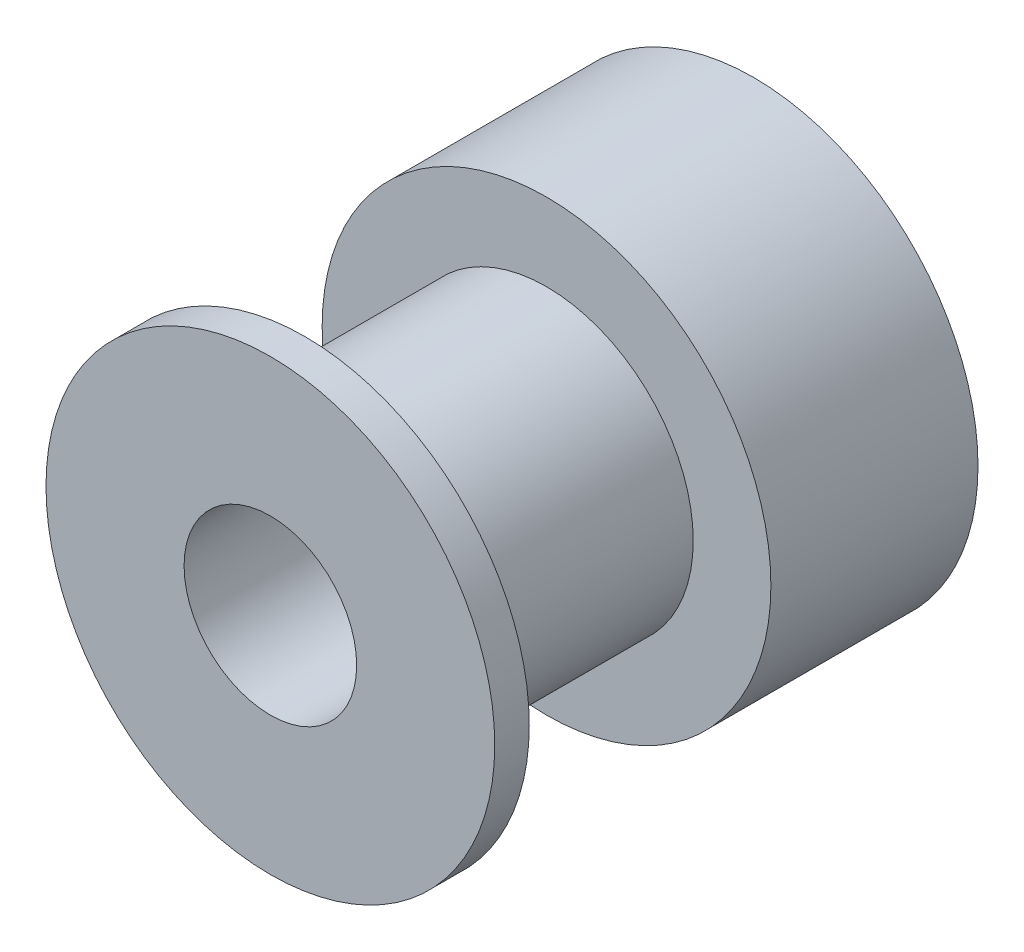
ISO-10303-21;
HEADER;
FILE_DESCRIPTION(('STEP AP214'),'2;1');
FILE_NAME('part.step','',(''),(''),'','','');
FILE_SCHEMA(('AUTOMOTIVE_DESIGN { 1 0 10303 214 1 1 1 1 }'));
ENDSEC;
DATA;
#1=APPLICATION_CONTEXT('core data for automotive mechanical design processes');
#2=APPLICATION_PROTOCOL_DEFINITION('international standard','automotive_design',2000,#1);
#3=PRODUCT_CONTEXT('',#1,'mechanical');
#4=PRODUCT('Part','Part','',(#3));
#5=PRODUCT_RELATED_PRODUCT_CATEGORY('part','',(#4));
#6=PRODUCT_DEFINITION_FORMATION('','',#4);
#7=PRODUCT_DEFINITION_CONTEXT('part definition',#1,'design');
#8=PRODUCT_DEFINITION('design','',#6,#7);
#9=PRODUCT_DEFINITION_SHAPE('','',#8);
#10=(LENGTH_UNIT() NAMED_UNIT(*) SI_UNIT(.MILLI.,.METRE.));
#11=(NAMED_UNIT(*) PLANE_ANGLE_UNIT() SI_UNIT($,.RADIAN.));
#12=(NAMED_UNIT(*) SI_UNIT($,.STERADIAN.) SOLID_ANGLE_UNIT());
#13=UNCERTAINTY_MEASURE_WITH_UNIT(LENGTH_MEASURE(1.E-05),#10,'distance_accuracy_value','');
#14=(GEOMETRIC_REPRESENTATION_CONTEXT(3) GLOBAL_UNCERTAINTY_ASSIGNED_CONTEXT((#13)) GLOBAL_UNIT_ASSIGNED_CONTEXT((#10,
#11,#12)) REPRESENTATION_CONTEXT('',''));
#15=CARTESIAN_POINT('',(0.,0.,0.));
#16=DIRECTION('',(0.,0.,1.));
#17=DIRECTION('',(1.,0.,0.));
#18=AXIS2_PLACEMENT_3D('',#15,#16,#17);
#19=CARTESIAN_POINT('',(0.,0.,6.));
#20=DIRECTION('',(0.,0.,-1.));
#21=DIRECTION('',(-1.,0.,0.));
#22=AXIS2_PLACEMENT_3D('',#19,#20,#21);
#23=CYLINDRICAL_SURFACE('',#22,6.5);
#24=CARTESIAN_POINT('',(-6.5,0.,4.5));
#25=CARTESIAN_POINT('',(-6.49999849532867,-0.0830761724763344,4.49999733464411));
#26=CARTESIAN_POINT('',(-6.49839124214547,-0.166183602986827,4.49307507318891));
#27=CARTESIAN_POINT('',(-6.49213500375529,-0.330029933246627,4.46560235711435));
#28=CARTESIAN_POINT('',(-6.48748401185166,-0.410767233683362,4.4450429115586));
#29=CARTESIAN_POINT('',(-6.47565710646771,-0.567482400649439,4.39098030105907));
#30=CARTESIAN_POINT('',(-6.46848397910972,-0.643465410431957,4.35749141486865));
#31=CARTESIAN_POINT('',(-6.45238316831829,-0.788732955280501,4.27856773493164));
#32=CARTESIAN_POINT('',(-6.44345549077589,-0.85801751283594,4.23313298129406));
#33=CARTESIAN_POINT('',(-6.42464323305021,-0.98915235312321,4.13075474832276));
#34=CARTESIAN_POINT('',(-6.41474568654138,-1.05086679216121,4.07363963829749));
#35=CARTESIAN_POINT('',(-6.39519859507266,-1.16393060397695,3.94989007342867));
#36=CARTESIAN_POINT('',(-6.38554907436474,-1.2152789664991,3.88325469183953));
#37=CARTESIAN_POINT('',(-6.36746174180576,-1.3067669575256,3.74133307243966));
#38=CARTESIAN_POINT('',(-6.35904049089481,-1.34675925477788,3.66594955902317));
#39=CARTESIAN_POINT('',(-6.34455046029963,-1.41345395330062,3.50930490134943));
#40=CARTESIAN_POINT('',(-6.33848136485541,-1.44015813854149,3.4280445477549));
#41=CARTESIAN_POINT('',(-6.32951534623235,-1.4790642425856,3.26343419841731));
#42=CARTESIAN_POINT('',(-6.32656557105072,-1.49150809496879,3.1801443266252));
#43=CARTESIAN_POINT('',(-6.32401364937952,-1.50229307046533,3.01261091295436));
#44=CARTESIAN_POINT('',(-6.32441104286173,-1.50063613156308,2.92836750371725));
#45=CARTESIAN_POINT('',(-6.32846083321139,-1.48346063285703,2.7631371921762));
#46=CARTESIAN_POINT('',(-6.33204661249555,-1.46822575315178,2.68211891865606));
#47=CARTESIAN_POINT('',(-6.34196351386388,-1.42477741479348,2.52382020809838));
#48=CARTESIAN_POINT('',(-6.34829480548987,-1.39656315462671,2.44654000222292));
#49=CARTESIAN_POINT('',(-6.36305332227188,-1.32770349075046,2.29712732835907));
#50=CARTESIAN_POINT('',(-6.37149843240945,-1.28695129246528,2.22504591908903));
#51=CARTESIAN_POINT('',(-6.38952239681953,-1.19424748975256,2.08864076371062));
#52=CARTESIAN_POINT('',(-6.39910142196225,-1.14229419645531,2.02431818974098));
#53=CARTESIAN_POINT('',(-6.41859777640793,-1.02717321086453,1.90362604994903));
#54=CARTESIAN_POINT('',(-6.42851768847713,-0.963764950845054,1.84748611487504));
#55=CARTESIAN_POINT('',(-6.44736816069401,-0.828318641053406,1.74659692902464));
#56=CARTESIAN_POINT('',(-6.45629869876005,-0.75628039874503,1.70184793245142));
#57=CARTESIAN_POINT('',(-6.47219854082994,-0.605321277972371,1.62494408585668));
#58=CARTESIAN_POINT('',(-6.47916273202417,-0.526383143294249,1.59282198430733));
#59=CARTESIAN_POINT('',(-6.49030757986402,-0.364032396252583,1.54236385630495));
#60=CARTESIAN_POINT('',(-6.49448868821629,-0.280620512374238,1.52402559261153));
#61=CARTESIAN_POINT('',(-6.49953102945198,-0.11365732393164,1.50199584965185));
#62=CARTESIAN_POINT('',(-6.50046326526885,-0.030149445012729,1.49799106394027));
#63=CARTESIAN_POINT('',(-6.49910299913129,0.136342371579224,1.50388901475928));
#64=CARTESIAN_POINT('',(-6.49681074208307,0.219326348562745,1.513790695068));
#65=CARTESIAN_POINT('',(-6.48930412349636,0.381357903798023,1.54696119660577));
#66=CARTESIAN_POINT('',(-6.48412623941868,0.4604414648757,1.57006324131714));
#67=CARTESIAN_POINT('',(-6.47142910428788,0.613609622481664,1.62879158892437));
#68=CARTESIAN_POINT('',(-6.4639096389422,0.687693760726587,1.66441903813585));
#69=CARTESIAN_POINT('',(-6.44718996088191,0.830037615110187,1.74782264392098));
#70=CARTESIAN_POINT('',(-6.43796535296184,0.898188410296326,1.7957796918852));
#71=CARTESIAN_POINT('',(-6.41890391913982,1.02558718048179,1.90224561735856));
#72=CARTESIAN_POINT('',(-6.40906700421673,1.08483385664762,1.96075603154156));
#73=CARTESIAN_POINT('',(-6.38964047483402,1.19400102833017,2.08811238587903));
#74=CARTESIAN_POINT('',(-6.3800601750374,1.24370343589042,2.1571469646774));
#75=CARTESIAN_POINT('',(-6.36246188496285,1.33081235446409,2.30276588021528));
#76=CARTESIAN_POINT('',(-6.35444382521927,1.3682194122462,2.37934988103845));
#77=CARTESIAN_POINT('',(-6.34095951164845,1.42941066868129,2.53747598842252));
#78=CARTESIAN_POINT('',(-6.33547846174878,1.45327404481082,2.61898612968344));
#79=CARTESIAN_POINT('',(-6.3276660054956,1.48692530676327,2.78500399284777));
#80=CARTESIAN_POINT('',(-6.32533402889436,1.49671574099563,2.86951116919002));
#81=CARTESIAN_POINT('',(-6.32412253425542,1.50182536015786,3.03691822705262));
#82=CARTESIAN_POINT('',(-6.32516029248236,1.49749127871471,3.11980711064856));
#83=CARTESIAN_POINT('',(-6.33038270361014,1.47525685980881,3.28363867866818));
#84=CARTESIAN_POINT('',(-6.33456731037362,1.45735672124418,3.36458139160761));
#85=CARTESIAN_POINT('',(-6.34556939165105,1.40867420720143,3.52190991079113));
#86=CARTESIAN_POINT('',(-6.35237543592818,1.37794771033572,3.59831386070585));
#87=CARTESIAN_POINT('',(-6.36785683112449,1.304530822271,3.74493180654133));
#88=CARTESIAN_POINT('',(-6.37653240158127,1.26183902581514,3.81514507412735));
#89=CARTESIAN_POINT('',(-6.39501829374307,1.16457679516263,3.94908552859008));
#90=CARTESIAN_POINT('',(-6.4048496868242,1.10976162033287,4.01263211954958));
#91=CARTESIAN_POINT('',(-6.42440402438128,0.990297714593212,4.12973824763829));
#92=CARTESIAN_POINT('',(-6.43412694306169,0.92564669602438,4.18329545493028));
#93=CARTESIAN_POINT('',(-6.45253999299533,0.787191932761554,4.27966726794881));
#94=CARTESIAN_POINT('',(-6.46121270567525,0.713266869084886,4.32231111828978));
#95=CARTESIAN_POINT('',(-6.47637045552876,0.559109641475368,4.39449914940861));
#96=CARTESIAN_POINT('',(-6.48285722936411,0.478882547101934,4.42405373510293));
#97=CARTESIAN_POINT('',(-6.49182723396727,0.332210374198767,4.46427847355574));
#98=CARTESIAN_POINT('',(-6.49487228966801,0.266526367321008,4.477647271027));
#99=CARTESIAN_POINT('',(-6.4989592245111,0.133901630280835,4.49550886661472));
#100=CARTESIAN_POINT('',(-6.5000012127936,0.0669609687898304,4.50000214832734));
#101=CARTESIAN_POINT('',(-6.5,0.,4.5));
#102=B_SPLINE_CURVE_WITH_KNOTS('',3,(#24,#25,#26,#27,#28,#29,#30,#31,#32,#33,#34,#35,#36,#37,
#38,#39,#40,#41,#42,#43,#44,#45,#46,#47,#48,#49,#50,#51,#52,#53,#54,#55,#56,#57,#58,#59,#60,#61,
#62,#63,#64,#65,#66,#67,#68,#69,#70,#71,#72,#73,#74,#75,#76,#77,#78,#79,#80,#81,#82,#83,#84,#85,
#86,#87,#88,#89,#90,#91,#92,#93,#94,#95,#96,#97,#98,#99,#100,#101),.UNSPECIFIED.,.T.,.F.,(4,2,2,
2,2,2,2,2,2,2,2,2,2,2,2,2,2,2,2,2,2,2,2,2,2,2,2,2,2,2,2,2,2,2,2,2,2,2,4),(0.,0.248983311217114,
0.498130939431098,0.747004202472747,0.995876629917202,1.24870930222222,1.50156660317464,
1.75756840109411,2.0135358206962,2.26509316141456,2.51661592915602,2.76300377758328,
3.00940684320484,3.25796969712265,3.50657005489342,3.7611752627951,4.01578615203542,
4.27105309773002,4.52627860236006,4.77589001432916,5.02548246887371,5.27198911757478,
5.51851833225481,5.76889433751052,6.01930682944867,6.27489540554877,6.53047261420162,
6.7845398863154,7.03856114466417,7.28639401438666,7.53422325058917,7.78098389306531,
8.02777352833801,8.28009323709707,8.53247172133002,8.78858609727297,9.04449651578221,
9.24519271684376,9.44587798236134),.UNSPECIFIED.);
#103=CARTESIAN_POINT('',(-6.5,0.,4.5));
#104=VERTEX_POINT('',#103);
#105=EDGE_CURVE('E72',#104,#104,#102,.T.);
#106=ORIENTED_EDGE('',*,*,#105,.T.);
#107=EDGE_LOOP('',(#106));
#108=FACE_BOUND('',#107,.T.);
#109=CARTESIAN_POINT('',(0.,-6.5,4.5));
#110=CARTESIAN_POINT('',(0.0830761724763347,-6.49999849532867,4.49999733464411));
#111=CARTESIAN_POINT('',(0.166183602986827,-6.49839124214547,4.49307507318891));
#112=CARTESIAN_POINT('',(0.330029933246627,-6.49213500375529,4.46560235711435));
#113=CARTESIAN_POINT('',(0.410767233683363,-6.48748401185166,4.4450429115586));
#114=CARTESIAN_POINT('',(0.567482400649439,-6.47565710646771,4.39098030105907));
#115=CARTESIAN_POINT('',(0.643465410431957,-6.46848397910972,4.35749141486865));
#116=CARTESIAN_POINT('',(0.788732955280501,-6.45238316831829,4.27856773493164));
#117=CARTESIAN_POINT('',(0.85801751283594,-6.44345549077589,4.23313298129406));
#118=CARTESIAN_POINT('',(0.989152353123209,-6.42464323305021,4.13075474832276));
#119=CARTESIAN_POINT('',(1.05086679216121,-6.41474568654138,4.07363963829749));
#120=CARTESIAN_POINT('',(1.16393060397695,-6.39519859507266,3.94989007342867));
#121=CARTESIAN_POINT('',(1.2152789664991,-6.38554907436474,3.88325469183953));
#122=CARTESIAN_POINT('',(1.3067669575256,-6.36746174180576,3.74133307243966));
#123=CARTESIAN_POINT('',(1.34675925477788,-6.35904049089481,3.66594955902317));
#124=CARTESIAN_POINT('',(1.41345395330062,-6.34455046029963,3.50930490134943));
#125=CARTESIAN_POINT('',(1.44015813854149,-6.33848136485541,3.4280445477549));
#126=CARTESIAN_POINT('',(1.4790642425856,-6.32951534623235,3.26343419841731));
#127=CARTESIAN_POINT('',(1.49150809496879,-6.32656557105072,3.1801443266252));
#128=CARTESIAN_POINT('',(1.50229307046533,-6.32401364937952,3.01261091295436));
#129=CARTESIAN_POINT('',(1.50063613156308,-6.32441104286173,2.92836750371725));
#130=CARTESIAN_POINT('',(1.48346063285703,-6.32846083321139,2.7631371921762));
#131=CARTESIAN_POINT('',(1.46822575315178,-6.33204661249556,2.68211891865606));
#132=CARTESIAN_POINT('',(1.42477741479348,-6.34196351386388,2.52382020809838));
#133=CARTESIAN_POINT('',(1.39656315462671,-6.34829480548987,2.44654000222292));
#134=CARTESIAN_POINT('',(1.32770349075046,-6.36305332227188,2.29712732835907));
#135=CARTESIAN_POINT('',(1.28695129246528,-6.37149843240945,2.22504591908903));
#136=CARTESIAN_POINT('',(1.19424748975256,-6.38952239681953,2.08864076371062));
#137=CARTESIAN_POINT('',(1.1422941964553,-6.39910142196225,2.02431818974098));
#138=CARTESIAN_POINT('',(1.02717321086453,-6.41859777640793,1.90362604994903));
#139=CARTESIAN_POINT('',(0.963764950845054,-6.42851768847713,1.84748611487504));
#140=CARTESIAN_POINT('',(0.828318641053406,-6.44736816069401,1.74659692902464));
#141=CARTESIAN_POINT('',(0.75628039874503,-6.45629869876005,1.70184793245142));
#142=CARTESIAN_POINT('',(0.605321277972371,-6.47219854082994,1.62494408585668));
#143=CARTESIAN_POINT('',(0.526383143294248,-6.47916273202417,1.59282198430733));
#144=CARTESIAN_POINT('',(0.364032396252582,-6.49030757986402,1.54236385630495));
#145=CARTESIAN_POINT('',(0.280620512374237,-6.49448868821629,1.52402559261153));
#146=CARTESIAN_POINT('',(0.11365732393164,-6.49953102945198,1.50199584965185));
#147=CARTESIAN_POINT('',(0.0301494450127289,-6.50046326526885,1.49799106394027));
#148=CARTESIAN_POINT('',(-0.136342371579224,-6.49910299913129,1.50388901475928));
#149=CARTESIAN_POINT('',(-0.219326348562745,-6.49681074208307,1.513790695068));
#150=CARTESIAN_POINT('',(-0.381357903798023,-6.48930412349636,1.54696119660577));
#151=CARTESIAN_POINT('',(-0.4604414648757,-6.48412623941868,1.57006324131714));
#152=CARTESIAN_POINT('',(-0.613609622481664,-6.47142910428788,1.62879158892437));
#153=CARTESIAN_POINT('',(-0.687693760726587,-6.4639096389422,1.66441903813585));
#154=CARTESIAN_POINT('',(-0.830037615110187,-6.44718996088191,1.74782264392098));
#155=CARTESIAN_POINT('',(-0.898188410296326,-6.43796535296184,1.7957796918852));
#156=CARTESIAN_POINT('',(-1.02558718048179,-6.41890391913982,1.90224561735856));
#157=CARTESIAN_POINT('',(-1.08483385664762,-6.40906700421673,1.96075603154156));
#158=CARTESIAN_POINT('',(-1.19400102833017,-6.38964047483402,2.08811238587903));
#159=CARTESIAN_POINT('',(-1.24370343589042,-6.3800601750374,2.1571469646774));
#160=CARTESIAN_POINT('',(-1.33081235446409,-6.36246188496285,2.30276588021528));
#161=CARTESIAN_POINT('',(-1.3682194122462,-6.35444382521927,2.37934988103845));
#162=CARTESIAN_POINT('',(-1.42941066868129,-6.34095951164845,2.53747598842252));
#163=CARTESIAN_POINT('',(-1.45327404481082,-6.33547846174879,2.61898612968344));
#164=CARTESIAN_POINT('',(-1.48692530676326,-6.3276660054956,2.78500399284777));
#165=CARTESIAN_POINT('',(-1.49671574099563,-6.32533402889437,2.86951116919002));
#166=CARTESIAN_POINT('',(-1.50182536015786,-6.32412253425542,3.03691822705262));
#167=CARTESIAN_POINT('',(-1.49749127871471,-6.32516029248236,3.11980711064856));
#168=CARTESIAN_POINT('',(-1.47525685980881,-6.33038270361014,3.28363867866818));
#169=CARTESIAN_POINT('',(-1.45735672124418,-6.33456731037362,3.36458139160761));
#170=CARTESIAN_POINT('',(-1.40867420720143,-6.34556939165105,3.52190991079113));
#171=CARTESIAN_POINT('',(-1.37794771033572,-6.35237543592818,3.59831386070585));
#172=CARTESIAN_POINT('',(-1.304530822271,-6.36785683112449,3.74493180654133));
#173=CARTESIAN_POINT('',(-1.26183902581514,-6.37653240158127,3.81514507412735));
#174=CARTESIAN_POINT('',(-1.16457679516263,-6.39501829374307,3.94908552859008));
#175=CARTESIAN_POINT('',(-1.10976162033287,-6.4048496868242,4.01263211954958));
#176=CARTESIAN_POINT('',(-0.990297714593212,-6.42440402438128,4.12973824763829));
#177=CARTESIAN_POINT('',(-0.92564669602438,-6.43412694306169,4.18329545493028));
#178=CARTESIAN_POINT('',(-0.787191932761553,-6.45253999299533,4.27966726794881));
#179=CARTESIAN_POINT('',(-0.713266869084886,-6.46121270567525,4.32231111828978));
#180=CARTESIAN_POINT('',(-0.559109641475368,-6.47637045552876,4.39449914940861));
#181=CARTESIAN_POINT('',(-0.478882547101934,-6.48285722936411,4.42405373510293));
#182=CARTESIAN_POINT('',(-0.332210374198767,-6.49182723396727,4.46427847355574));
#183=CARTESIAN_POINT('',(-0.266526367321008,-6.49487228966801,4.477647271027));
#184=CARTESIAN_POINT('',(-0.133901630280834,-6.4989592245111,4.49550886661472));
#185=CARTESIAN_POINT('',(-0.0669609687898301,-6.5000012127936,4.50000214832734));
#186=CARTESIAN_POINT('',(0.,-6.5,4.5));
#187=B_SPLINE_CURVE_WITH_KNOTS('',3,(#109,#110,#111,#112,#113,#114,#115,#116,#117,#118,#119,
#120,#121,#122,#123,#124,#125,#126,#127,#128,#129,#130,#131,#132,#133,#134,#135,#136,#137,#138,
#139,#140,#141,#142,#143,#144,#145,#146,#147,#148,#149,#150,#151,#152,#153,#154,#155,#156,#157,
#158,#159,#160,#161,#162,#163,#164,#165,#166,#167,#168,#169,#170,#171,#172,#173,#174,#175,#176,
#177,#178,#179,#180,#181,#182,#183,#184,#185,#186),.UNSPECIFIED.,.T.,.F.,(4,2,2,2,2,2,2,2,2,2,2,
2,2,2,2,2,2,2,2,2,2,2,2,2,2,2,2,2,2,2,2,2,2,2,2,2,2,2,4),(0.,0.248983311217114,
0.498130939431098,0.747004202472747,0.995876629917202,1.24870930222222,1.50156660317464,
1.75756840109411,2.0135358206962,2.26509316141456,2.51661592915602,2.76300377758328,
3.00940684320484,3.25796969712265,3.50657005489342,3.7611752627951,4.01578615203542,
4.27105309773002,4.52627860236006,4.77589001432915,5.02548246887371,5.27198911757477,
5.51851833225481,5.76889433751052,6.01930682944867,6.27489540554877,6.53047261420161,
6.7845398863154,7.03856114466417,7.28639401438666,7.53422325058917,7.7809838930653,
8.02777352833801,8.28009323709706,8.53247172133002,8.78858609727296,9.04449651578221,
9.24519271684376,9.44587798236134),.UNSPECIFIED.);
#188=CARTESIAN_POINT('',(0.,-6.5,4.5));
#189=VERTEX_POINT('',#188);
#190=EDGE_CURVE('E71',#189,#189,#187,.T.);
#191=ORIENTED_EDGE('',*,*,#190,.T.);
#192=EDGE_LOOP('',(#191));
#193=FACE_BOUND('',#192,.T.);
#194=CARTESIAN_POINT('',(0.,0.,6.));
#195=DIRECTION('',(0.,0.,1.));
#196=DIRECTION('',(1.,0.,0.));
#197=AXIS2_PLACEMENT_3D('',#194,#195,#196);
#198=CIRCLE('',#197,6.5);
#199=CARTESIAN_POINT('',(6.5,0.,6.));
#200=VERTEX_POINT('',#199);
#201=EDGE_CURVE('E50',#200,#200,#198,.T.);
#202=ORIENTED_EDGE('',*,*,#201,.F.);
#203=EDGE_LOOP('',(#202));
#204=FACE_BOUND('',#203,.T.);
#205=CARTESIAN_POINT('',(0.,0.,0.));
#206=DIRECTION('',(0.,0.,1.));
#207=DIRECTION('',(1.,0.,0.));
#208=AXIS2_PLACEMENT_3D('',#205,#206,#207);
#209=CIRCLE('',#208,6.5);
#210=CARTESIAN_POINT('',(6.5,0.,0.));
#211=VERTEX_POINT('',#210);
#212=EDGE_CURVE('E56',#211,#211,#209,.T.);
#213=ORIENTED_EDGE('',*,*,#212,.T.);
#214=EDGE_LOOP('',(#213));
#215=FACE_BOUND('',#214,.T.);
#216=ADVANCED_FACE('F36',(#108,#193,#204,#215),#23,.T.);
#217=CARTESIAN_POINT('',(0.,0.,6.));
#218=DIRECTION('',(0.,0.,1.));
#219=DIRECTION('',(1.,0.,0.));
#220=AXIS2_PLACEMENT_3D('',#217,#218,#219);
#221=PLANE('',#220);
#222=CARTESIAN_POINT('',(0.,0.,6.));
#223=DIRECTION('',(0.,0.,1.));
#224=DIRECTION('',(1.,0.,0.));
#225=AXIS2_PLACEMENT_3D('',#222,#223,#224);
#226=CIRCLE('',#225,4.25);
#227=CARTESIAN_POINT('',(4.25,0.,6.));
#228=VERTEX_POINT('',#227);
#229=EDGE_CURVE('E10',#228,#228,#226,.T.);
#230=ORIENTED_EDGE('',*,*,#229,.F.);
#231=EDGE_LOOP('',(#230));
#232=FACE_BOUND('',#231,.T.);
#233=ORIENTED_EDGE('',*,*,#201,.T.);
#234=EDGE_LOOP('',(#233));
#235=FACE_BOUND('',#234,.T.);
#236=ADVANCED_FACE('F128',(#232,#235),#221,.T.);
#237=CARTESIAN_POINT('',(0.,0.,0.));
#238=DIRECTION('',(0.,0.,1.));
#239=DIRECTION('',(1.,0.,0.));
#240=AXIS2_PLACEMENT_3D('',#237,#238,#239);
#241=PLANE('',#240);
#242=CARTESIAN_POINT('',(0.,0.,0.));
#243=DIRECTION('',(0.,0.,1.));
#244=DIRECTION('',(1.,0.,0.));
#245=AXIS2_PLACEMENT_3D('',#242,#243,#244);
#246=CIRCLE('',#245,2.5);
#247=CARTESIAN_POINT('',(2.5,0.,0.));
#248=VERTEX_POINT('',#247);
#249=EDGE_CURVE('E98',#248,#248,#246,.T.);
#250=ORIENTED_EDGE('',*,*,#249,.T.);
#251=EDGE_LOOP('',(#250));
#252=FACE_BOUND('',#251,.T.);
#253=ORIENTED_EDGE('',*,*,#212,.F.);
#254=EDGE_LOOP('',(#253));
#255=FACE_BOUND('',#254,.T.);
#256=ADVANCED_FACE('F134',(#252,#255),#241,.F.);
#257=CARTESIAN_POINT('',(0.,0.,13.));
#258=DIRECTION('',(0.,0.,-1.));
#259=DIRECTION('',(-1.,0.,0.));
#260=AXIS2_PLACEMENT_3D('',#257,#258,#259);
#261=CYLINDRICAL_SURFACE('',#260,4.25);
#262=CARTESIAN_POINT('',(0.,0.,13.));
#263=DIRECTION('',(0.,0.,1.));
#264=DIRECTION('',(1.,0.,0.));
#265=AXIS2_PLACEMENT_3D('',#262,#263,#264);
#266=CIRCLE('',#265,4.25);
#267=CARTESIAN_POINT('',(4.25,0.,13.));
#268=VERTEX_POINT('',#267);
#269=EDGE_CURVE('E59',#268,#268,#266,.T.);
#270=ORIENTED_EDGE('',*,*,#269,.F.);
#271=EDGE_LOOP('',(#270));
#272=FACE_BOUND('',#271,.T.);
#273=ORIENTED_EDGE('',*,*,#229,.T.);
#274=EDGE_LOOP('',(#273));
#275=FACE_BOUND('',#274,.T.);
#276=ADVANCED_FACE('F147',(#272,#275),#261,.T.);
#277=CARTESIAN_POINT('',(0.,0.,14.));
#278=DIRECTION('',(0.,0.,-1.));
#279=DIRECTION('',(-1.,0.,0.));
#280=AXIS2_PLACEMENT_3D('',#277,#278,#279);
#281=CYLINDRICAL_SURFACE('',#280,6.5);
#282=CARTESIAN_POINT('',(0.,0.,14.));
#283=DIRECTION('',(0.,0.,1.));
#284=DIRECTION('',(1.,0.,0.));
#285=AXIS2_PLACEMENT_3D('',#282,#283,#284);
#286=CIRCLE('',#285,6.5);
#287=CARTESIAN_POINT('',(6.5,0.,14.));
#288=VERTEX_POINT('',#287);
#289=EDGE_CURVE('E103',#288,#288,#286,.T.);
#290=ORIENTED_EDGE('',*,*,#289,.F.);
#291=EDGE_LOOP('',(#290));
#292=FACE_BOUND('',#291,.T.);
#293=CARTESIAN_POINT('',(0.,0.,13.));
#294=DIRECTION('',(0.,0.,1.));
#295=DIRECTION('',(1.,0.,0.));
#296=AXIS2_PLACEMENT_3D('',#293,#294,#295);
#297=CIRCLE('',#296,6.5);
#298=CARTESIAN_POINT('',(6.5,0.,13.));
#299=VERTEX_POINT('',#298);
#300=EDGE_CURVE('E102',#299,#299,#297,.T.);
#301=ORIENTED_EDGE('',*,*,#300,.T.);
#302=EDGE_LOOP('',(#301));
#303=FACE_BOUND('',#302,.T.);
#304=ADVANCED_FACE('F110',(#292,#303),#281,.T.);
#305=CARTESIAN_POINT('',(0.,0.,14.));
#306=DIRECTION('',(0.,0.,1.));
#307=DIRECTION('',(1.,0.,0.));
#308=AXIS2_PLACEMENT_3D('',#305,#306,#307);
#309=PLANE('',#308);
#310=CARTESIAN_POINT('',(0.,0.,14.));
#311=DIRECTION('',(0.,0.,1.));
#312=DIRECTION('',(1.,0.,0.));
#313=AXIS2_PLACEMENT_3D('',#310,#311,#312);
#314=CIRCLE('',#313,2.5);
#315=CARTESIAN_POINT('',(2.5,0.,14.));
#316=VERTEX_POINT('',#315);
#317=EDGE_CURVE('E91',#316,#316,#314,.T.);
#318=ORIENTED_EDGE('',*,*,#317,.F.);
#319=EDGE_LOOP('',(#318));
#320=FACE_BOUND('',#319,.T.);
#321=ORIENTED_EDGE('',*,*,#289,.T.);
#322=EDGE_LOOP('',(#321));
#323=FACE_BOUND('',#322,.T.);
#324=ADVANCED_FACE('F114',(#320,#323),#309,.T.);
#325=CARTESIAN_POINT('',(0.,0.,13.));
#326=DIRECTION('',(0.,0.,1.));
#327=DIRECTION('',(1.,0.,0.));
#328=AXIS2_PLACEMENT_3D('',#325,#326,#327);
#329=PLANE('',#328);
#330=ORIENTED_EDGE('',*,*,#269,.T.);
#331=EDGE_LOOP('',(#330));
#332=FACE_BOUND('',#331,.T.);
#333=ORIENTED_EDGE('',*,*,#300,.F.);
#334=EDGE_LOOP('',(#333));
#335=FACE_BOUND('',#334,.T.);
#336=ADVANCED_FACE('F112',(#332,#335),#329,.F.);
#337=CARTESIAN_POINT('',(0.,0.,-20.));
#338=DIRECTION('',(0.,0.,1.));
#339=DIRECTION('',(1.,0.,0.));
#340=AXIS2_PLACEMENT_3D('',#337,#338,#339);
#341=CYLINDRICAL_SURFACE('',#340,2.5);
#342=CARTESIAN_POINT('',(-2.5,0.,1.5));
#343=CARTESIAN_POINT('',(-2.49999625789732,-0.0767298334620161,1.50000409100988));
#344=CARTESIAN_POINT('',(-2.4964290461501,-0.153582320644178,1.50592867092626));
#345=CARTESIAN_POINT('',(-2.48249903608568,-0.304975509530679,1.52932431951533));
#346=CARTESIAN_POINT('',(-2.47211948032719,-0.379510034596047,1.54682386185422));
#347=CARTESIAN_POINT('',(-2.44561558054488,-0.523751827790837,1.59238636116686));
#348=CARTESIAN_POINT('',(-2.42951973272944,-0.593481028226566,1.62039695816316));
#349=CARTESIAN_POINT('',(-2.39295367626407,-0.727030318214659,1.68586033314103));
#350=CARTESIAN_POINT('',(-2.37248455380255,-0.790851869416383,1.72331076696875));
#351=CARTESIAN_POINT('',(-2.32705360719088,-0.916299278999315,1.80977482670858));
#352=CARTESIAN_POINT('',(-2.30186792195985,-0.977384020081416,1.85945369535139));
#353=CARTESIAN_POINT('',(-2.25030439279634,-1.09088270411891,1.96746720382827));
#354=CARTESIAN_POINT('',(-2.22392505153571,-1.14328534948112,2.02581293718732));
#355=CARTESIAN_POINT('',(-2.1691106699591,-1.24444996762974,2.15792351049673));
#356=CARTESIAN_POINT('',(-2.14082017703649,-1.29197766378809,2.23270177098129));
#357=CARTESIAN_POINT('',(-2.08938301412124,-1.37361437764896,2.39084657324311));
#358=CARTESIAN_POINT('',(-2.06622802273938,-1.4077451733516,2.47419889624757));
#359=CARTESIAN_POINT('',(-2.0335462966093,-1.45440601714222,2.62659645065324));
#360=CARTESIAN_POINT('',(-2.02207883137591,-1.47016197246826,2.69423599861032));
#361=CARTESIAN_POINT('',(-2.00590308295503,-1.49216172340475,2.83180371583036));
#362=CARTESIAN_POINT('',(-2.00118639643759,-1.49841734556836,2.90172892875449));
#363=CARTESIAN_POINT('',(-1.99920922463856,-1.50105508796009,3.04201149421733));
#364=CARTESIAN_POINT('',(-2.00196337012718,-1.49741783408419,3.1123694250932));
#365=CARTESIAN_POINT('',(-2.01453261443741,-1.48046060478828,3.25127877542759));
#366=CARTESIAN_POINT('',(-2.02435302432226,-1.46713334620103,3.31982879584744));
#367=CARTESIAN_POINT('',(-2.04953186944258,-1.43173921881792,3.4525302421281));
#368=CARTESIAN_POINT('',(-2.06481711652537,-1.40978748666087,3.51672705392448));
#369=CARTESIAN_POINT('',(-2.09927051350828,-1.35795061770837,3.64069499092812));
#370=CARTESIAN_POINT('',(-2.11844008623465,-1.32806257259705,3.70046448342392));
#371=CARTESIAN_POINT('',(-2.16255327268985,-1.25517983184583,3.8249840971228));
#372=CARTESIAN_POINT('',(-2.18792043372992,-1.21080724397723,3.88877809295493));
#373=CARTESIAN_POINT('',(-2.23930599764381,-1.11291092784003,4.00867648366701));
#374=CARTESIAN_POINT('',(-2.26532500262149,-1.05937845100579,4.06477343397651));
#375=CARTESIAN_POINT('',(-2.31935504958317,-0.935811834382968,4.17561298182176));
#376=CARTESIAN_POINT('',(-2.34713836268532,-0.864517682704959,4.22907730601599));
#377=CARTESIAN_POINT('',(-2.39772428433981,-0.712276050459002,4.32312204719791));
#378=CARTESIAN_POINT('',(-2.42052955425515,-0.631333763943566,4.36370935378995));
#379=CARTESIAN_POINT('',(-2.45730392066151,-0.467197585268208,4.4279321827959));
#380=CARTESIAN_POINT('',(-2.47173957439704,-0.384467624173582,4.45247535571591));
#381=CARTESIAN_POINT('',(-2.4921884281355,-0.215047895144641,4.48701119740538));
#382=CARTESIAN_POINT('',(-2.49821172952738,-0.128363005661321,4.49702131775358));
#383=CARTESIAN_POINT('',(-2.5009057037461,0.0337146143773947,4.50150784767831));
#384=CARTESIAN_POINT('',(-2.49873521714286,0.109042473418716,4.49790885508517));
#385=CARTESIAN_POINT('',(-2.48778712087048,0.257829401986059,4.47957414692808));
#386=CARTESIAN_POINT('',(-2.47900964518037,0.331288509376104,4.46483865719419));
#387=CARTESIAN_POINT('',(-2.4559479244219,0.472574932157611,4.42545656718754));
#388=CARTESIAN_POINT('',(-2.44180275662555,0.540495750928482,4.40105965092653));
#389=CARTESIAN_POINT('',(-2.40913880862845,0.671265749087262,4.34332262363473));
#390=CARTESIAN_POINT('',(-2.39061916586511,0.734113924963907,4.30998074865333));
#391=CARTESIAN_POINT('',(-2.3484549623736,0.860006262823862,4.23144302079129));
#392=CARTESIAN_POINT('',(-2.3244780273988,0.922394150456836,4.18537617092161));
#393=CARTESIAN_POINT('',(-2.27474265574732,1.03902603131014,4.08460860651138));
#394=CARTESIAN_POINT('',(-2.2489821658636,1.09326040273738,4.02989784514746));
#395=CARTESIAN_POINT('',(-2.19445423909891,1.19931996735579,3.90508960996285));
#396=CARTESIAN_POINT('',(-2.16573241746291,1.24991019630915,3.8339161145345));
#397=CARTESIAN_POINT('',(-2.1121618206671,1.33845238915667,3.6827839754318));
#398=CARTESIAN_POINT('',(-2.0873089799769,1.37641766769781,3.60283470610722));
#399=CARTESIAN_POINT('',(-2.04984909240519,1.43142578795776,3.45375697769331));
#400=CARTESIAN_POINT('',(-2.03575659328729,1.4512162533619,3.38601968764141));
#401=CARTESIAN_POINT('',(-2.01409605743544,1.48113663905972,3.2474679219199));
#402=CARTESIAN_POINT('',(-2.00651897642721,1.4912799529763,3.17665785567217));
#403=CARTESIAN_POINT('',(-1.99900446616268,1.50134130416631,3.03362305240297));
#404=CARTESIAN_POINT('',(-1.99909576445937,1.50122089107869,2.96139400931296));
#405=CARTESIAN_POINT('',(-2.0069771789285,1.49066472959328,2.81810556439054));
#406=CARTESIAN_POINT('',(-2.0147714813882,1.48022337215759,2.7470468199194));
#407=CARTESIAN_POINT('',(-2.0363318524298,1.45040174148913,2.61151158242781));
#408=CARTESIAN_POINT('',(-2.04979211805581,1.43147636845351,2.54688290569313));
#409=CARTESIAN_POINT('',(-2.08105501960151,1.38563242076993,2.42166274552579));
#410=CARTESIAN_POINT('',(-2.09885929040482,1.35871083588479,2.36107279303945));
#411=CARTESIAN_POINT('',(-2.14012990550917,1.29289245555732,2.23568014277922));
#412=CARTESIAN_POINT('',(-2.16404587582639,1.25279167675753,2.17165889614569));
#413=CARTESIAN_POINT('',(-2.21320127030768,1.16375698389085,2.05061992738271));
#414=CARTESIAN_POINT('',(-2.23844177205021,1.11481579607798,1.99360803784744));
#415=CARTESIAN_POINT('',(-2.29225690291476,1.00009777425734,1.87864905086833));
#416=CARTESIAN_POINT('',(-2.32070308663658,0.932876819313905,1.82206892510381));
#417=CARTESIAN_POINT('',(-2.37365428872367,0.78846243444559,1.72090214413669));
#418=CARTESIAN_POINT('',(-2.39815789310936,0.711265444501541,1.67631978801521));
#419=CARTESIAN_POINT('',(-2.43985578654394,0.551125230801455,1.60221419242626));
#420=CARTESIAN_POINT('',(-2.45725077479787,0.468430086957215,1.57227193507317));
#421=CARTESIAN_POINT('',(-2.48366273001246,0.297973306118809,1.52727530478903));
#422=CARTESIAN_POINT('',(-2.49271125871485,0.210232099648613,1.51216483214301));
#423=CARTESIAN_POINT('',(-2.49802001168187,0.101558096917537,1.50330254529134));
#424=CARTESIAN_POINT('',(-2.49876114656362,0.0812762590282775,1.5020655826939));
#425=CARTESIAN_POINT('',(-2.49975164517367,0.0406658206871119,1.50041375362914));
#426=CARTESIAN_POINT('',(-2.50000099184316,0.020337218637569,1.4999989156791));
#427=CARTESIAN_POINT('',(-2.5,0.,1.5));
#428=B_SPLINE_CURVE_WITH_KNOTS('',3,(#342,#343,#344,#345,#346,#347,#348,#349,#350,#351,#352,
#353,#354,#355,#356,#357,#358,#359,#360,#361,#362,#363,#364,#365,#366,#367,#368,#369,#370,#371,
#372,#373,#374,#375,#376,#377,#378,#379,#380,#381,#382,#383,#384,#385,#386,#387,#388,#389,#390,
#391,#392,#393,#394,#395,#396,#397,#398,#399,#400,#401,#402,#403,#404,#405,#406,#407,#408,#409,
#410,#411,#412,#413,#414,#415,#416,#417,#418,#419,#420,#421,#422,#423,#424,#425,#426,#427),
.UNSPECIFIED.,.T.,.F.,(4,2,2,2,2,2,2,2,2,2,2,2,2,2,2,2,2,2,2,2,2,2,2,2,2,2,2,2,2,2,2,2,2,2,2,2,
2,2,2,2,2,2,4),(0.,0.230102237548649,0.460772627520012,0.690308884600012,0.919788197992275,
1.16681590732473,1.414162579348,1.69183813189807,1.96906040692092,2.17933829855633,
2.38935420916578,2.59978170870726,2.81036753273872,3.01823267593207,3.22617409809868,
3.47046995225163,3.71500044803674,3.99360957884691,4.27206939275324,4.53296790696559,
4.79355286918236,5.01875602722426,5.24395461863455,5.46367785689772,5.68344445659025,
5.92601365818362,6.16886690081836,6.44336762428009,6.71757792616456,6.93257787314692,
7.14727888733318,7.36278425777433,7.57840681155725,7.78364098331141,7.98895251523034,
8.22578610052286,8.46281544370207,8.73854311775518,9.01436946031985,9.28175654462676,
9.54812832184448,9.60911473335177,9.6701032602764),.UNSPECIFIED.);
#429=CARTESIAN_POINT('',(-2.5,0.,1.5));
#430=VERTEX_POINT('',#429);
#431=EDGE_CURVE('E40',#430,#430,#428,.T.);
#432=ORIENTED_EDGE('',*,*,#431,.T.);
#433=EDGE_LOOP('',(#432));
#434=FACE_BOUND('',#433,.T.);
#435=CARTESIAN_POINT('',(0.,-2.5,4.5));
#436=CARTESIAN_POINT('',(-0.0767298334620155,-2.49999625789732,4.49999590899012));
#437=CARTESIAN_POINT('',(-0.153582320644177,-2.4964290461501,4.49407132907374));
#438=CARTESIAN_POINT('',(-0.304975509530678,-2.48249903608568,4.47067568048467));
#439=CARTESIAN_POINT('',(-0.379510034596047,-2.47211948032719,4.45317613814577));
#440=CARTESIAN_POINT('',(-0.523751827790836,-2.44561558054488,4.40761363883314));
#441=CARTESIAN_POINT('',(-0.593481028226566,-2.42951973272944,4.37960304183684));
#442=CARTESIAN_POINT('',(-0.727030318214659,-2.39295367626407,4.31413966685897));
#443=CARTESIAN_POINT('',(-0.790851869416383,-2.37248455380255,4.27668923303125));
#444=CARTESIAN_POINT('',(-0.916299278999314,-2.32705360719088,4.19022517329142));
#445=CARTESIAN_POINT('',(-0.977384020081415,-2.30186792195985,4.14054630464861));
#446=CARTESIAN_POINT('',(-1.09088270411891,-2.25030439279634,4.03253279617173));
#447=CARTESIAN_POINT('',(-1.14328534948112,-2.22392505153571,3.97418706281268));
#448=CARTESIAN_POINT('',(-1.24444996762974,-2.1691106699591,3.84207648950327));
#449=CARTESIAN_POINT('',(-1.29197766378809,-2.14082017703649,3.76729822901871));
#450=CARTESIAN_POINT('',(-1.37361437764896,-2.08938301412124,3.60915342675689));
#451=CARTESIAN_POINT('',(-1.4077451733516,-2.06622802273938,3.52580110375243));
#452=CARTESIAN_POINT('',(-1.45440601714221,-2.0335462966093,3.37340354934676));
#453=CARTESIAN_POINT('',(-1.47016197246826,-2.02207883137591,3.30576400138968));
#454=CARTESIAN_POINT('',(-1.49216172340475,-2.00590308295503,3.16819628416964));
#455=CARTESIAN_POINT('',(-1.49841734556836,-2.0011863964376,3.09827107124551));
#456=CARTESIAN_POINT('',(-1.50105508796009,-1.99920922463856,2.95798850578266));
#457=CARTESIAN_POINT('',(-1.49741783408418,-2.00196337012718,2.8876305749068));
#458=CARTESIAN_POINT('',(-1.48046060478828,-2.01453261443741,2.74872122457241));
#459=CARTESIAN_POINT('',(-1.46713334620103,-2.02435302432226,2.68017120415256));
#460=CARTESIAN_POINT('',(-1.43173921881792,-2.04953186944258,2.54746975787189));
#461=CARTESIAN_POINT('',(-1.40978748666087,-2.06481711652537,2.48327294607552));
#462=CARTESIAN_POINT('',(-1.35795061770837,-2.09927051350828,2.35930500907188));
#463=CARTESIAN_POINT('',(-1.32806257259705,-2.11844008623465,2.29953551657607));
#464=CARTESIAN_POINT('',(-1.25517983184583,-2.16255327268985,2.1750159028772));
#465=CARTESIAN_POINT('',(-1.21080724397723,-2.18792043372992,2.11122190704507));
#466=CARTESIAN_POINT('',(-1.11291092784003,-2.23930599764381,1.99132351633298));
#467=CARTESIAN_POINT('',(-1.05937845100578,-2.26532500262149,1.93522656602349));
#468=CARTESIAN_POINT('',(-0.935811834382965,-2.31935504958317,1.82438701817824));
#469=CARTESIAN_POINT('',(-0.864517682704955,-2.34713836268532,1.77092269398401));
#470=CARTESIAN_POINT('',(-0.712276050458998,-2.39772428433981,1.67687795280209));
#471=CARTESIAN_POINT('',(-0.631333763943562,-2.42052955425515,1.63629064621005));
#472=CARTESIAN_POINT('',(-0.467197585268204,-2.45730392066151,1.5720678172041));
#473=CARTESIAN_POINT('',(-0.384467624173578,-2.47173957439704,1.54752464428409));
#474=CARTESIAN_POINT('',(-0.215047895144638,-2.49218842813551,1.51298880259462));
#475=CARTESIAN_POINT('',(-0.128363005661318,-2.49821172952738,1.50297868224643));
#476=CARTESIAN_POINT('',(0.033714614377397,-2.5009057037461,1.49849215232169));
#477=CARTESIAN_POINT('',(0.109042473418718,-2.49873521714286,1.50209114491483));
#478=CARTESIAN_POINT('',(0.257829401986061,-2.48778712087048,1.52042585307192));
#479=CARTESIAN_POINT('',(0.331288509376106,-2.47900964518037,1.53516134280581));
#480=CARTESIAN_POINT('',(0.472574932157613,-2.4559479244219,1.57454343281246));
#481=CARTESIAN_POINT('',(0.540495750928484,-2.44180275662555,1.59894034907347));
#482=CARTESIAN_POINT('',(0.671265749087263,-2.40913880862844,1.65667737636527));
#483=CARTESIAN_POINT('',(0.734113924963909,-2.39061916586511,1.69001925134667));
#484=CARTESIAN_POINT('',(0.860006262823864,-2.3484549623736,1.76855697920871));
#485=CARTESIAN_POINT('',(0.922394150456837,-2.3244780273988,1.81462382907839));
#486=CARTESIAN_POINT('',(1.03902603131014,-2.27474265574732,1.91539139348862));
#487=CARTESIAN_POINT('',(1.09326040273738,-2.2489821658636,1.97010215485254));
#488=CARTESIAN_POINT('',(1.19931996735579,-2.19445423909891,2.09491039003715));
#489=CARTESIAN_POINT('',(1.24991019630915,-2.16573241746291,2.1660838854655));
#490=CARTESIAN_POINT('',(1.33845238915668,-2.1121618206671,2.3172160245682));
#491=CARTESIAN_POINT('',(1.37641766769781,-2.0873089799769,2.39716529389279));
#492=CARTESIAN_POINT('',(1.43142578795776,-2.04984909240519,2.54624302230669));
#493=CARTESIAN_POINT('',(1.4512162533619,-2.03575659328729,2.61398031235859));
#494=CARTESIAN_POINT('',(1.48113663905972,-2.01409605743544,2.7525320780801));
#495=CARTESIAN_POINT('',(1.49127995297631,-2.00651897642721,2.82334214432783));
#496=CARTESIAN_POINT('',(1.50134130416631,-1.99900446616268,2.96637694759703));
#497=CARTESIAN_POINT('',(1.50122089107869,-1.99909576445937,3.03860599068704));
#498=CARTESIAN_POINT('',(1.49066472959328,-2.0069771789285,3.18189443560946));
#499=CARTESIAN_POINT('',(1.48022337215759,-2.0147714813882,3.2529531800806));
#500=CARTESIAN_POINT('',(1.45040174148913,-2.0363318524298,3.38848841757219));
#501=CARTESIAN_POINT('',(1.43147636845351,-2.04979211805581,3.45311709430687));
#502=CARTESIAN_POINT('',(1.38563242076993,-2.08105501960151,3.57833725447422));
#503=CARTESIAN_POINT('',(1.35871083588479,-2.09885929040482,3.63892720696055));
#504=CARTESIAN_POINT('',(1.29289245555733,-2.14012990550917,3.76431985722078));
#505=CARTESIAN_POINT('',(1.25279167675753,-2.16404587582639,3.82834110385431));
#506=CARTESIAN_POINT('',(1.16375698389085,-2.21320127030768,3.94938007261729));
#507=CARTESIAN_POINT('',(1.11481579607798,-2.23844177205021,4.00639196215256));
#508=CARTESIAN_POINT('',(1.00009777425734,-2.29225690291476,4.12135094913167));
#509=CARTESIAN_POINT('',(0.932876819313905,-2.32070308663658,4.17793107489619));
#510=CARTESIAN_POINT('',(0.78846243444559,-2.37365428872367,4.27909785586331));
#511=CARTESIAN_POINT('',(0.711265444501541,-2.39815789310936,4.32368021198479));
#512=CARTESIAN_POINT('',(0.551125230801455,-2.43985578654394,4.39778580757374));
#513=CARTESIAN_POINT('',(0.468430086957215,-2.45725077479787,4.42772806492683));
#514=CARTESIAN_POINT('',(0.297973306118809,-2.48366273001246,4.47272469521097));
#515=CARTESIAN_POINT('',(0.210232099648614,-2.49271125871485,4.48783516785699));
#516=CARTESIAN_POINT('',(0.101558096917537,-2.49802001168187,4.49669745470866));
#517=CARTESIAN_POINT('',(0.0812762590282785,-2.49876114656362,4.4979344173061));
#518=CARTESIAN_POINT('',(0.040665820687113,-2.49975164517367,4.49958624637086));
#519=CARTESIAN_POINT('',(0.02033721863757,-2.50000099184316,4.5000010843209));
#520=CARTESIAN_POINT('',(0.,-2.5,4.5));
#521=B_SPLINE_CURVE_WITH_KNOTS('',3,(#435,#436,#437,#438,#439,#440,#441,#442,#443,#444,#445,
#446,#447,#448,#449,#450,#451,#452,#453,#454,#455,#456,#457,#458,#459,#460,#461,#462,#463,#464,
#465,#466,#467,#468,#469,#470,#471,#472,#473,#474,#475,#476,#477,#478,#479,#480,#481,#482,#483,
#484,#485,#486,#487,#488,#489,#490,#491,#492,#493,#494,#495,#496,#497,#498,#499,#500,#501,#502,
#503,#504,#505,#506,#507,#508,#509,#510,#511,#512,#513,#514,#515,#516,#517,#518,#519,#520),
.UNSPECIFIED.,.T.,.F.,(4,2,2,2,2,2,2,2,2,2,2,2,2,2,2,2,2,2,2,2,2,2,2,2,2,2,2,2,2,2,2,2,2,2,2,2,
2,2,2,2,2,2,4),(0.,0.230102237548649,0.460772627520012,0.690308884600012,0.919788197992275,
1.16681590732473,1.414162579348,1.69183813189807,1.96906040692092,2.17933829855633,
2.38935420916578,2.59978170870726,2.81036753273872,3.01823267593207,3.22617409809868,
3.47046995225163,3.71500044803674,3.99360957884691,4.27206939275324,4.5329679069656,
4.79355286918236,5.01875602722426,5.24395461863455,5.46367785689772,5.68344445659025,
5.92601365818362,6.16886690081836,6.44336762428009,6.71757792616456,6.93257787314692,
7.14727888733319,7.36278425777433,7.57840681155725,7.78364098331142,7.98895251523035,
8.22578610052286,8.46281544370208,8.73854311775519,9.01436946031985,9.28175654462677,
9.54812832184448,9.60911473335177,9.67010326027641),.UNSPECIFIED.);
#522=CARTESIAN_POINT('',(0.,-2.5,4.5));
#523=VERTEX_POINT('',#522);
#524=EDGE_CURVE('E64',#523,#523,#521,.T.);
#525=ORIENTED_EDGE('',*,*,#524,.T.);
#526=EDGE_LOOP('',(#525));
#527=FACE_BOUND('',#526,.T.);
#528=ORIENTED_EDGE('',*,*,#317,.T.);
#529=EDGE_LOOP('',(#528));
#530=FACE_BOUND('',#529,.T.);
#531=ORIENTED_EDGE('',*,*,#249,.F.);
#532=EDGE_LOOP('',(#531));
#533=FACE_BOUND('',#532,.T.);
#534=ADVANCED_FACE('F73',(#434,#527,#530,#533),#341,.F.);
#535=CARTESIAN_POINT('',(0.,-10.,3.));
#536=DIRECTION('',(0.,1.,0.));
#537=DIRECTION('',(0.,0.,1.));
#538=AXIS2_PLACEMENT_3D('',#535,#536,#537);
#539=CYLINDRICAL_SURFACE('',#538,1.5);
#540=ORIENTED_EDGE('',*,*,#524,.F.);
#541=EDGE_LOOP('',(#540));
#542=FACE_BOUND('',#541,.T.);
#543=ORIENTED_EDGE('',*,*,#190,.F.);
#544=EDGE_LOOP('',(#543));
#545=FACE_BOUND('',#544,.T.);
#546=ADVANCED_FACE('F76',(#542,#545),#539,.F.);
#547=CARTESIAN_POINT('',(-10.,0.,3.));
#548=DIRECTION('',(1.,0.,0.));
#549=DIRECTION('',(0.,0.,-1.));
#550=AXIS2_PLACEMENT_3D('',#547,#548,#549);
#551=CYLINDRICAL_SURFACE('',#550,1.5);
#552=ORIENTED_EDGE('',*,*,#431,.F.);
#553=EDGE_LOOP('',(#552));
#554=FACE_BOUND('',#553,.T.);
#555=ORIENTED_EDGE('',*,*,#105,.F.);
#556=EDGE_LOOP('',(#555));
#557=FACE_BOUND('',#556,.T.);
#558=ADVANCED_FACE('F79',(#554,#557),#551,.F.);
#559=CLOSED_SHELL('',(#216,#236,#256,#276,#304,#324,#336,#534,#546,#558));
#560=MANIFOLD_SOLID_BREP('B2',#559);
#561=ADVANCED_BREP_SHAPE_REPRESENTATION('',(#18,#560),#14);
#562=SHAPE_DEFINITION_REPRESENTATION(#9,#561);
ENDSEC;
END-ISO-10303-21;
